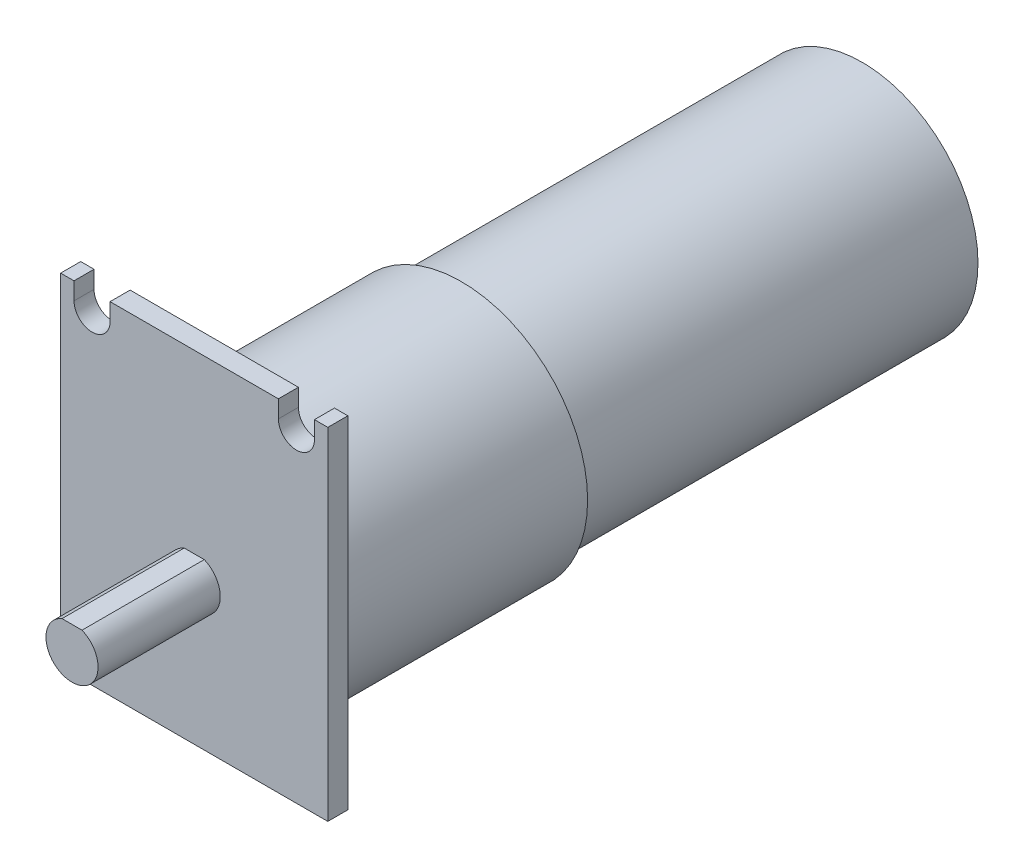
ISO-10303-21;
HEADER;
FILE_DESCRIPTION(('STEP AP214'),'2;1');
FILE_NAME('part.step','',(''),(''),'','','');
FILE_SCHEMA(('AUTOMOTIVE_DESIGN { 1 0 10303 214 1 1 1 1 }'));
ENDSEC;
DATA;
#1=APPLICATION_CONTEXT('core data for automotive mechanical design processes');
#2=APPLICATION_PROTOCOL_DEFINITION('international standard','automotive_design',2000,#1);
#3=PRODUCT_CONTEXT('',#1,'mechanical');
#4=PRODUCT('Part','Part','',(#3));
#5=PRODUCT_RELATED_PRODUCT_CATEGORY('part','',(#4));
#6=PRODUCT_DEFINITION_FORMATION('','',#4);
#7=PRODUCT_DEFINITION_CONTEXT('part definition',#1,'design');
#8=PRODUCT_DEFINITION('design','',#6,#7);
#9=PRODUCT_DEFINITION_SHAPE('','',#8);
#10=(LENGTH_UNIT() NAMED_UNIT(*) SI_UNIT(.MILLI.,.METRE.));
#11=(NAMED_UNIT(*) PLANE_ANGLE_UNIT() SI_UNIT($,.RADIAN.));
#12=(NAMED_UNIT(*) SI_UNIT($,.STERADIAN.) SOLID_ANGLE_UNIT());
#13=UNCERTAINTY_MEASURE_WITH_UNIT(LENGTH_MEASURE(1.E-05),#10,'distance_accuracy_value','');
#14=(GEOMETRIC_REPRESENTATION_CONTEXT(3) GLOBAL_UNCERTAINTY_ASSIGNED_CONTEXT((#13)) GLOBAL_UNIT_ASSIGNED_CONTEXT((#10,
#11,#12)) REPRESENTATION_CONTEXT('',''));
#15=CARTESIAN_POINT('',(0.,0.,0.));
#16=DIRECTION('',(0.,0.,1.));
#17=DIRECTION('',(1.,0.,0.));
#18=AXIS2_PLACEMENT_3D('',#15,#16,#17);
#19=CARTESIAN_POINT('',(0.,0.,60.));
#20=DIRECTION('',(0.,0.,-1.));
#21=DIRECTION('',(-1.,0.,0.));
#22=AXIS2_PLACEMENT_3D('',#19,#20,#21);
#23=CYLINDRICAL_SURFACE('',#22,17.35);
#24=CARTESIAN_POINT('',(0.,0.,60.));
#25=DIRECTION('',(0.,0.,1.));
#26=DIRECTION('',(1.,0.,0.));
#27=AXIS2_PLACEMENT_3D('',#24,#25,#26);
#28=CIRCLE('',#27,17.35);
#29=CARTESIAN_POINT('',(17.35,0.,60.));
#30=VERTEX_POINT('',#29);
#31=EDGE_CURVE('E240',#30,#30,#28,.T.);
#32=ORIENTED_EDGE('',*,*,#31,.F.);
#33=EDGE_LOOP('',(#32));
#34=FACE_BOUND('',#33,.T.);
#35=CARTESIAN_POINT('',(0.,0.,0.));
#36=DIRECTION('',(0.,0.,1.));
#37=DIRECTION('',(1.,0.,0.));
#38=AXIS2_PLACEMENT_3D('',#35,#36,#37);
#39=CIRCLE('',#38,17.35);
#40=CARTESIAN_POINT('',(17.35,0.,0.));
#41=VERTEX_POINT('',#40);
#42=EDGE_CURVE('E237',#41,#41,#39,.T.);
#43=ORIENTED_EDGE('',*,*,#42,.T.);
#44=EDGE_LOOP('',(#43));
#45=FACE_BOUND('',#44,.T.);
#46=ADVANCED_FACE('F52',(#34,#45),#23,.T.);
#47=CARTESIAN_POINT('',(0.,0.,0.));
#48=DIRECTION('',(0.,0.,1.));
#49=DIRECTION('',(1.,0.,0.));
#50=AXIS2_PLACEMENT_3D('',#47,#48,#49);
#51=PLANE('',#50);
#52=ORIENTED_EDGE('',*,*,#42,.F.);
#53=EDGE_LOOP('',(#52));
#54=FACE_BOUND('',#53,.T.);
#55=ADVANCED_FACE('F329',(#54),#51,.F.);
#56=CARTESIAN_POINT('',(0.,0.,97.));
#57=DIRECTION('',(0.,0.,-1.));
#58=DIRECTION('',(-1.,0.,0.));
#59=AXIS2_PLACEMENT_3D('',#56,#57,#58);
#60=CYLINDRICAL_SURFACE('',#59,18.9);
#61=CARTESIAN_POINT('',(0.,0.,97.));
#62=DIRECTION('',(0.,0.,1.));
#63=DIRECTION('',(1.,0.,0.));
#64=AXIS2_PLACEMENT_3D('',#61,#62,#63);
#65=CIRCLE('',#64,18.9);
#66=CARTESIAN_POINT('',(18.9,0.,97.));
#67=VERTEX_POINT('',#66);
#68=EDGE_CURVE('E234',#67,#67,#65,.T.);
#69=ORIENTED_EDGE('',*,*,#68,.F.);
#70=EDGE_LOOP('',(#69));
#71=FACE_BOUND('',#70,.T.);
#72=CARTESIAN_POINT('',(0.,0.,60.));
#73=DIRECTION('',(0.,0.,1.));
#74=DIRECTION('',(1.,0.,0.));
#75=AXIS2_PLACEMENT_3D('',#72,#73,#74);
#76=CIRCLE('',#75,18.9);
#77=CARTESIAN_POINT('',(18.9,0.,60.));
#78=VERTEX_POINT('',#77);
#79=EDGE_CURVE('E215',#78,#78,#76,.T.);
#80=ORIENTED_EDGE('',*,*,#79,.T.);
#81=EDGE_LOOP('',(#80));
#82=FACE_BOUND('',#81,.T.);
#83=ADVANCED_FACE('F334',(#71,#82),#60,.T.);
#84=CARTESIAN_POINT('',(0.,0.,60.));
#85=DIRECTION('',(0.,0.,1.));
#86=DIRECTION('',(1.,0.,0.));
#87=AXIS2_PLACEMENT_3D('',#84,#85,#86);
#88=PLANE('',#87);
#89=ORIENTED_EDGE('',*,*,#31,.T.);
#90=EDGE_LOOP('',(#89));
#91=FACE_BOUND('',#90,.T.);
#92=ORIENTED_EDGE('',*,*,#79,.F.);
#93=EDGE_LOOP('',(#92));
#94=FACE_BOUND('',#93,.T.);
#95=ADVANCED_FACE('F326',(#91,#94),#88,.F.);
#96=CARTESIAN_POINT('',(-20.,21.1,100.));
#97=DIRECTION('',(1.,0.,0.));
#98=DIRECTION('',(0.,1.,0.));
#99=AXIS2_PLACEMENT_3D('',#96,#97,#98);
#100=PLANE('',#99);
#101=DIRECTION('',(0.,-1.,0.));
#102=VECTOR('',#101,1.);
#103=CARTESIAN_POINT('',(-20.,21.1,97.));
#104=LINE('',#103,#102);
#105=CARTESIAN_POINT('',(-20.,30.,97.));
#106=VERTEX_POINT('',#105);
#107=CARTESIAN_POINT('',(-20.,-21.1,97.));
#108=VERTEX_POINT('',#107);
#109=EDGE_CURVE('E212',#106,#108,#104,.T.);
#110=ORIENTED_EDGE('',*,*,#109,.T.);
#111=DIRECTION('',(0.,0.,-1.));
#112=VECTOR('',#111,1.);
#113=CARTESIAN_POINT('',(-20.,-21.1,100.));
#114=LINE('',#113,#112);
#115=CARTESIAN_POINT('',(-20.,-21.1,100.));
#116=VERTEX_POINT('',#115);
#117=EDGE_CURVE('E118',#116,#108,#114,.T.);
#118=ORIENTED_EDGE('',*,*,#117,.F.);
#119=DIRECTION('',(0.,1.,0.));
#120=VECTOR('',#119,1.);
#121=CARTESIAN_POINT('',(-20.,21.1,100.));
#122=LINE('',#121,#120);
#123=CARTESIAN_POINT('',(-20.,30.,100.));
#124=VERTEX_POINT('',#123);
#125=EDGE_CURVE('E72',#116,#124,#122,.T.);
#126=ORIENTED_EDGE('',*,*,#125,.T.);
#127=DIRECTION('',(0.,0.,-1.));
#128=VECTOR('',#127,1.);
#129=CARTESIAN_POINT('',(-20.,30.,100.));
#130=LINE('',#129,#128);
#131=EDGE_CURVE('E127',#124,#106,#130,.T.);
#132=ORIENTED_EDGE('',*,*,#131,.T.);
#133=EDGE_LOOP('',(#110,#118,#126,#132));
#134=FACE_BOUND('',#133,.T.);
#135=ADVANCED_FACE('F317',(#134),#100,.F.);
#136=CARTESIAN_POINT('',(20.,-21.1,100.));
#137=DIRECTION('',(0.,-1.,0.));
#138=DIRECTION('',(1.,0.,0.));
#139=AXIS2_PLACEMENT_3D('',#136,#137,#138);
#140=PLANE('',#139);
#141=DIRECTION('',(-1.,0.,0.));
#142=VECTOR('',#141,1.);
#143=CARTESIAN_POINT('',(20.,-21.1,97.));
#144=LINE('',#143,#142);
#145=CARTESIAN_POINT('',(20.,-21.1,97.));
#146=VERTEX_POINT('',#145);
#147=EDGE_CURVE('E209',#146,#108,#144,.T.);
#148=ORIENTED_EDGE('',*,*,#147,.F.);
#149=DIRECTION('',(0.,0.,-1.));
#150=VECTOR('',#149,1.);
#151=CARTESIAN_POINT('',(20.,-21.1,100.));
#152=LINE('',#151,#150);
#153=CARTESIAN_POINT('',(20.,-21.1,100.));
#154=VERTEX_POINT('',#153);
#155=EDGE_CURVE('E166',#154,#146,#152,.T.);
#156=ORIENTED_EDGE('',*,*,#155,.F.);
#157=DIRECTION('',(-1.,0.,0.));
#158=VECTOR('',#157,1.);
#159=CARTESIAN_POINT('',(20.,-21.1,100.));
#160=LINE('',#159,#158);
#161=EDGE_CURVE('E177',#154,#116,#160,.T.);
#162=ORIENTED_EDGE('',*,*,#161,.T.);
#163=ORIENTED_EDGE('',*,*,#117,.T.);
#164=EDGE_LOOP('',(#148,#156,#162,#163));
#165=FACE_BOUND('',#164,.T.);
#166=ADVANCED_FACE('F318',(#165),#140,.T.);
#167=CARTESIAN_POINT('',(20.,21.1,100.));
#168=DIRECTION('',(1.,0.,0.));
#169=DIRECTION('',(0.,0.,-1.));
#170=AXIS2_PLACEMENT_3D('',#167,#168,#169);
#171=PLANE('',#170);
#172=DIRECTION('',(0.,-1.,0.));
#173=VECTOR('',#172,1.);
#174=CARTESIAN_POINT('',(20.,21.1,97.));
#175=LINE('',#174,#173);
#176=CARTESIAN_POINT('',(20.,30.,97.));
#177=VERTEX_POINT('',#176);
#178=EDGE_CURVE('E163',#177,#146,#175,.T.);
#179=ORIENTED_EDGE('',*,*,#178,.F.);
#180=DIRECTION('',(0.,0.,-1.));
#181=VECTOR('',#180,1.);
#182=CARTESIAN_POINT('',(20.,30.,100.));
#183=LINE('',#182,#181);
#184=CARTESIAN_POINT('',(20.,30.,100.));
#185=VERTEX_POINT('',#184);
#186=EDGE_CURVE('E156',#185,#177,#183,.T.);
#187=ORIENTED_EDGE('',*,*,#186,.F.);
#188=DIRECTION('',(0.,-1.,0.));
#189=VECTOR('',#188,1.);
#190=CARTESIAN_POINT('',(20.,30.,100.));
#191=LINE('',#190,#189);
#192=EDGE_CURVE('E160',#185,#154,#191,.T.);
#193=ORIENTED_EDGE('',*,*,#192,.T.);
#194=ORIENTED_EDGE('',*,*,#155,.T.);
#195=EDGE_LOOP('',(#179,#187,#193,#194));
#196=FACE_BOUND('',#195,.T.);
#197=ADVANCED_FACE('F158',(#196),#171,.T.);
#198=CARTESIAN_POINT('',(20.,30.,100.));
#199=DIRECTION('',(0.,-1.,0.));
#200=DIRECTION('',(0.,0.,-1.));
#201=AXIS2_PLACEMENT_3D('',#198,#199,#200);
#202=PLANE('',#201);
#203=DIRECTION('',(-1.,0.,0.));
#204=VECTOR('',#203,1.);
#205=CARTESIAN_POINT('',(20.,30.,97.));
#206=LINE('',#205,#204);
#207=CARTESIAN_POINT('',(18.,30.,97.));
#208=VERTEX_POINT('',#207);
#209=EDGE_CURVE('E206',#177,#208,#206,.T.);
#210=ORIENTED_EDGE('',*,*,#209,.T.);
#211=DIRECTION('',(0.,0.,-1.));
#212=VECTOR('',#211,1.);
#213=CARTESIAN_POINT('',(18.,30.,100.));
#214=LINE('',#213,#212);
#215=CARTESIAN_POINT('',(18.,30.,100.));
#216=VERTEX_POINT('',#215);
#217=EDGE_CURVE('E167',#216,#208,#214,.T.);
#218=ORIENTED_EDGE('',*,*,#217,.F.);
#219=DIRECTION('',(-1.,0.,0.));
#220=VECTOR('',#219,1.);
#221=CARTESIAN_POINT('',(20.,30.,100.));
#222=LINE('',#221,#220);
#223=EDGE_CURVE('E170',#185,#216,#222,.T.);
#224=ORIENTED_EDGE('',*,*,#223,.F.);
#225=ORIENTED_EDGE('',*,*,#186,.T.);
#226=EDGE_LOOP('',(#210,#218,#224,#225));
#227=FACE_BOUND('',#226,.T.);
#228=ADVANCED_FACE('F171',(#227),#202,.F.);
#229=CARTESIAN_POINT('',(18.,30.,100.));
#230=DIRECTION('',(1.,0.,0.));
#231=DIRECTION('',(0.,0.,-1.));
#232=AXIS2_PLACEMENT_3D('',#229,#230,#231);
#233=PLANE('',#232);
#234=DIRECTION('',(0.,-1.,0.));
#235=VECTOR('',#234,1.);
#236=CARTESIAN_POINT('',(18.,30.,97.));
#237=LINE('',#236,#235);
#238=CARTESIAN_POINT('',(18.,27.4,97.));
#239=VERTEX_POINT('',#238);
#240=EDGE_CURVE('E203',#208,#239,#237,.T.);
#241=ORIENTED_EDGE('',*,*,#240,.T.);
#242=DIRECTION('',(0.,0.,-1.));
#243=VECTOR('',#242,1.);
#244=CARTESIAN_POINT('',(18.,27.4,100.));
#245=LINE('',#244,#243);
#246=CARTESIAN_POINT('',(18.,27.4,100.));
#247=VERTEX_POINT('',#246);
#248=EDGE_CURVE('E218',#247,#239,#245,.T.);
#249=ORIENTED_EDGE('',*,*,#248,.F.);
#250=DIRECTION('',(0.,-1.,0.));
#251=VECTOR('',#250,1.);
#252=CARTESIAN_POINT('',(18.,30.,100.));
#253=LINE('',#252,#251);
#254=EDGE_CURVE('E174',#216,#247,#253,.T.);
#255=ORIENTED_EDGE('',*,*,#254,.F.);
#256=ORIENTED_EDGE('',*,*,#217,.T.);
#257=EDGE_LOOP('',(#241,#249,#255,#256));
#258=FACE_BOUND('',#257,.T.);
#259=ADVANCED_FACE('F285',(#258),#233,.F.);
#260=CARTESIAN_POINT('',(15.3,27.4,100.));
#261=DIRECTION('',(0.,0.,-1.));
#262=DIRECTION('',(-1.,0.,0.));
#263=AXIS2_PLACEMENT_3D('',#260,#261,#262);
#264=CYLINDRICAL_SURFACE('',#263,2.7);
#265=CARTESIAN_POINT('',(15.3,27.4,97.));
#266=DIRECTION('',(0.,0.,1.));
#267=DIRECTION('',(1.,0.,0.));
#268=AXIS2_PLACEMENT_3D('',#265,#266,#267);
#269=CIRCLE('',#268,2.7);
#270=CARTESIAN_POINT('',(12.6,27.4,97.));
#271=VERTEX_POINT('',#270);
#272=EDGE_CURVE('E200',#271,#239,#269,.T.);
#273=ORIENTED_EDGE('',*,*,#272,.F.);
#274=DIRECTION('',(0.,0.,-1.));
#275=VECTOR('',#274,1.);
#276=CARTESIAN_POINT('',(12.6,27.4,100.));
#277=LINE('',#276,#275);
#278=CARTESIAN_POINT('',(12.6,27.4,100.));
#279=VERTEX_POINT('',#278);
#280=EDGE_CURVE('E220',#279,#271,#277,.T.);
#281=ORIENTED_EDGE('',*,*,#280,.F.);
#282=CARTESIAN_POINT('',(15.3,27.4,100.));
#283=DIRECTION('',(0.,0.,1.));
#284=DIRECTION('',(1.,0.,0.));
#285=AXIS2_PLACEMENT_3D('',#282,#283,#284);
#286=CIRCLE('',#285,2.7);
#287=EDGE_CURVE('E280',#279,#247,#286,.T.);
#288=ORIENTED_EDGE('',*,*,#287,.T.);
#289=ORIENTED_EDGE('',*,*,#248,.T.);
#290=EDGE_LOOP('',(#273,#281,#288,#289));
#291=FACE_BOUND('',#290,.T.);
#292=ADVANCED_FACE('F289',(#291),#264,.F.);
#293=CARTESIAN_POINT('',(12.6,27.4,100.));
#294=DIRECTION('',(-1.,0.,0.));
#295=DIRECTION('',(0.,0.,1.));
#296=AXIS2_PLACEMENT_3D('',#293,#294,#295);
#297=PLANE('',#296);
#298=DIRECTION('',(0.,1.,0.));
#299=VECTOR('',#298,1.);
#300=CARTESIAN_POINT('',(12.6,27.4,97.));
#301=LINE('',#300,#299);
#302=CARTESIAN_POINT('',(12.6,30.,97.));
#303=VERTEX_POINT('',#302);
#304=EDGE_CURVE('E198',#271,#303,#301,.T.);
#305=ORIENTED_EDGE('',*,*,#304,.T.);
#306=DIRECTION('',(0.,0.,-1.));
#307=VECTOR('',#306,1.);
#308=CARTESIAN_POINT('',(12.6,30.,100.));
#309=LINE('',#308,#307);
#310=CARTESIAN_POINT('',(12.6,30.,100.));
#311=VERTEX_POINT('',#310);
#312=EDGE_CURVE('E222',#311,#303,#309,.T.);
#313=ORIENTED_EDGE('',*,*,#312,.F.);
#314=DIRECTION('',(0.,1.,0.));
#315=VECTOR('',#314,1.);
#316=CARTESIAN_POINT('',(12.6,27.4,100.));
#317=LINE('',#316,#315);
#318=EDGE_CURVE('E278',#279,#311,#317,.T.);
#319=ORIENTED_EDGE('',*,*,#318,.F.);
#320=ORIENTED_EDGE('',*,*,#280,.T.);
#321=EDGE_LOOP('',(#305,#313,#319,#320));
#322=FACE_BOUND('',#321,.T.);
#323=ADVANCED_FACE('F294',(#322),#297,.F.);
#324=CARTESIAN_POINT('',(12.6,30.,100.));
#325=DIRECTION('',(0.,-1.,0.));
#326=DIRECTION('',(1.,0.,0.));
#327=AXIS2_PLACEMENT_3D('',#324,#325,#326);
#328=PLANE('',#327);
#329=DIRECTION('',(-1.,0.,0.));
#330=VECTOR('',#329,1.);
#331=CARTESIAN_POINT('',(12.6,30.,97.));
#332=LINE('',#331,#330);
#333=CARTESIAN_POINT('',(-12.6,30.,97.));
#334=VERTEX_POINT('',#333);
#335=EDGE_CURVE('E195',#303,#334,#332,.T.);
#336=ORIENTED_EDGE('',*,*,#335,.T.);
#337=DIRECTION('',(0.,0.,-1.));
#338=VECTOR('',#337,1.);
#339=CARTESIAN_POINT('',(-12.6,30.,100.));
#340=LINE('',#339,#338);
#341=CARTESIAN_POINT('',(-12.6,30.,100.));
#342=VERTEX_POINT('',#341);
#343=EDGE_CURVE('E225',#342,#334,#340,.T.);
#344=ORIENTED_EDGE('',*,*,#343,.F.);
#345=DIRECTION('',(-1.,0.,0.));
#346=VECTOR('',#345,1.);
#347=CARTESIAN_POINT('',(12.6,30.,100.));
#348=LINE('',#347,#346);
#349=EDGE_CURVE('E276',#311,#342,#348,.T.);
#350=ORIENTED_EDGE('',*,*,#349,.F.);
#351=ORIENTED_EDGE('',*,*,#312,.T.);
#352=EDGE_LOOP('',(#336,#344,#350,#351));
#353=FACE_BOUND('',#352,.T.);
#354=ADVANCED_FACE('F299',(#353),#328,.F.);
#355=CARTESIAN_POINT('',(-12.6,27.4,100.));
#356=DIRECTION('',(-1.,0.,0.));
#357=DIRECTION('',(0.,0.,1.));
#358=AXIS2_PLACEMENT_3D('',#355,#356,#357);
#359=PLANE('',#358);
#360=DIRECTION('',(0.,1.,0.));
#361=VECTOR('',#360,1.);
#362=CARTESIAN_POINT('',(-12.6,27.4,97.));
#363=LINE('',#362,#361);
#364=CARTESIAN_POINT('',(-12.6,27.4,97.));
#365=VERTEX_POINT('',#364);
#366=EDGE_CURVE('E192',#365,#334,#363,.T.);
#367=ORIENTED_EDGE('',*,*,#366,.F.);
#368=DIRECTION('',(0.,0.,-1.));
#369=VECTOR('',#368,1.);
#370=CARTESIAN_POINT('',(-12.6,27.4,100.));
#371=LINE('',#370,#369);
#372=CARTESIAN_POINT('',(-12.6,27.4,100.));
#373=VERTEX_POINT('',#372);
#374=EDGE_CURVE('E227',#373,#365,#371,.T.);
#375=ORIENTED_EDGE('',*,*,#374,.F.);
#376=DIRECTION('',(0.,1.,0.));
#377=VECTOR('',#376,1.);
#378=CARTESIAN_POINT('',(-12.6,27.4,100.));
#379=LINE('',#378,#377);
#380=EDGE_CURVE('E273',#373,#342,#379,.T.);
#381=ORIENTED_EDGE('',*,*,#380,.T.);
#382=ORIENTED_EDGE('',*,*,#343,.T.);
#383=EDGE_LOOP('',(#367,#375,#381,#382));
#384=FACE_BOUND('',#383,.T.);
#385=ADVANCED_FACE('F303',(#384),#359,.T.);
#386=CARTESIAN_POINT('',(-15.3,27.4,100.));
#387=DIRECTION('',(0.,0.,-1.));
#388=DIRECTION('',(-1.,0.,0.));
#389=AXIS2_PLACEMENT_3D('',#386,#387,#388);
#390=CYLINDRICAL_SURFACE('',#389,2.7);
#391=CARTESIAN_POINT('',(-15.3,27.4,97.));
#392=DIRECTION('',(0.,0.,-1.));
#393=DIRECTION('',(-1.,0.,0.));
#394=AXIS2_PLACEMENT_3D('',#391,#392,#393);
#395=CIRCLE('',#394,2.7);
#396=CARTESIAN_POINT('',(-18.,27.4,97.));
#397=VERTEX_POINT('',#396);
#398=EDGE_CURVE('E189',#365,#397,#395,.T.);
#399=ORIENTED_EDGE('',*,*,#398,.T.);
#400=DIRECTION('',(0.,0.,-1.));
#401=VECTOR('',#400,1.);
#402=CARTESIAN_POINT('',(-18.,27.4,100.));
#403=LINE('',#402,#401);
#404=CARTESIAN_POINT('',(-18.,27.4,100.));
#405=VERTEX_POINT('',#404);
#406=EDGE_CURVE('E229',#405,#397,#403,.T.);
#407=ORIENTED_EDGE('',*,*,#406,.F.);
#408=CARTESIAN_POINT('',(-15.3,27.4,100.));
#409=DIRECTION('',(0.,0.,-1.));
#410=DIRECTION('',(-1.,0.,0.));
#411=AXIS2_PLACEMENT_3D('',#408,#409,#410);
#412=CIRCLE('',#411,2.7);
#413=EDGE_CURVE('E271',#373,#405,#412,.T.);
#414=ORIENTED_EDGE('',*,*,#413,.F.);
#415=ORIENTED_EDGE('',*,*,#374,.T.);
#416=EDGE_LOOP('',(#399,#407,#414,#415));
#417=FACE_BOUND('',#416,.T.);
#418=ADVANCED_FACE('F308',(#417),#390,.F.);
#419=CARTESIAN_POINT('',(-18.,30.,100.));
#420=DIRECTION('',(1.,0.,0.));
#421=DIRECTION('',(0.,0.,-1.));
#422=AXIS2_PLACEMENT_3D('',#419,#420,#421);
#423=PLANE('',#422);
#424=DIRECTION('',(0.,-1.,0.));
#425=VECTOR('',#424,1.);
#426=CARTESIAN_POINT('',(-18.,30.,97.));
#427=LINE('',#426,#425);
#428=CARTESIAN_POINT('',(-18.,30.,97.));
#429=VERTEX_POINT('',#428);
#430=EDGE_CURVE('E185',#429,#397,#427,.T.);
#431=ORIENTED_EDGE('',*,*,#430,.F.);
#432=DIRECTION('',(0.,0.,-1.));
#433=VECTOR('',#432,1.);
#434=CARTESIAN_POINT('',(-18.,30.,100.));
#435=LINE('',#434,#433);
#436=CARTESIAN_POINT('',(-18.,30.,100.));
#437=VERTEX_POINT('',#436);
#438=EDGE_CURVE('E231',#437,#429,#435,.T.);
#439=ORIENTED_EDGE('',*,*,#438,.F.);
#440=DIRECTION('',(0.,-1.,0.));
#441=VECTOR('',#440,1.);
#442=CARTESIAN_POINT('',(-18.,30.,100.));
#443=LINE('',#442,#441);
#444=EDGE_CURVE('E268',#437,#405,#443,.T.);
#445=ORIENTED_EDGE('',*,*,#444,.T.);
#446=ORIENTED_EDGE('',*,*,#406,.T.);
#447=EDGE_LOOP('',(#431,#439,#445,#446));
#448=FACE_BOUND('',#447,.T.);
#449=ADVANCED_FACE('F313',(#448),#423,.T.);
#450=CARTESIAN_POINT('',(-20.,30.,100.));
#451=DIRECTION('',(0.,1.,0.));
#452=DIRECTION('',(-1.,0.,0.));
#453=AXIS2_PLACEMENT_3D('',#450,#451,#452);
#454=PLANE('',#453);
#455=DIRECTION('',(1.,0.,0.));
#456=VECTOR('',#455,1.);
#457=CARTESIAN_POINT('',(-20.,30.,97.));
#458=LINE('',#457,#456);
#459=EDGE_CURVE('E182',#106,#429,#458,.T.);
#460=ORIENTED_EDGE('',*,*,#459,.F.);
#461=ORIENTED_EDGE('',*,*,#131,.F.);
#462=DIRECTION('',(1.,0.,0.));
#463=VECTOR('',#462,1.);
#464=CARTESIAN_POINT('',(-20.,30.,100.));
#465=LINE('',#464,#463);
#466=EDGE_CURVE('E266',#124,#437,#465,.T.);
#467=ORIENTED_EDGE('',*,*,#466,.T.);
#468=ORIENTED_EDGE('',*,*,#438,.T.);
#469=EDGE_LOOP('',(#460,#461,#467,#468));
#470=FACE_BOUND('',#469,.T.);
#471=ADVANCED_FACE('F311',(#470),#454,.T.);
#472=CARTESIAN_POINT('',(-15.3,27.4,100.));
#473=DIRECTION('',(0.,0.,-1.));
#474=DIRECTION('',(-1.,0.,0.));
#475=AXIS2_PLACEMENT_3D('',#472,#473,#474);
#476=PLANE('',#475);
#477=DIRECTION('',(-1.,0.,0.));
#478=VECTOR('',#477,1.);
#479=CARTESIAN_POINT('',(-15.3,3.6,100.));
#480=LINE('',#479,#478);
#481=CARTESIAN_POINT('',(1.5,3.6,100.));
#482=VERTEX_POINT('',#481);
#483=CARTESIAN_POINT('',(-1.5,3.6,100.));
#484=VERTEX_POINT('',#483);
#485=EDGE_CURVE('E12',#482,#484,#480,.T.);
#486=ORIENTED_EDGE('',*,*,#485,.F.);
#487=CARTESIAN_POINT('',(0.,0.,100.));
#488=DIRECTION('',(0.,0.,-1.));
#489=DIRECTION('',(-1.,0.,0.));
#490=AXIS2_PLACEMENT_3D('',#487,#488,#489);
#491=CIRCLE('',#490,3.9);
#492=EDGE_CURVE('E59',#484,#482,#491,.F.);
#493=ORIENTED_EDGE('',*,*,#492,.F.);
#494=EDGE_LOOP('',(#486,#493));
#495=FACE_BOUND('',#494,.T.);
#496=ORIENTED_EDGE('',*,*,#125,.F.);
#497=ORIENTED_EDGE('',*,*,#161,.F.);
#498=ORIENTED_EDGE('',*,*,#192,.F.);
#499=ORIENTED_EDGE('',*,*,#223,.T.);
#500=ORIENTED_EDGE('',*,*,#254,.T.);
#501=ORIENTED_EDGE('',*,*,#287,.F.);
#502=ORIENTED_EDGE('',*,*,#318,.T.);
#503=ORIENTED_EDGE('',*,*,#349,.T.);
#504=ORIENTED_EDGE('',*,*,#380,.F.);
#505=ORIENTED_EDGE('',*,*,#413,.T.);
#506=ORIENTED_EDGE('',*,*,#444,.F.);
#507=ORIENTED_EDGE('',*,*,#466,.F.);
#508=EDGE_LOOP('',(#496,#497,#498,#499,#500,#501,#502,#503,#504,#505,#506,#507));
#509=FACE_BOUND('',#508,.T.);
#510=ADVANCED_FACE('F176',(#495,#509),#476,.F.);
#511=CARTESIAN_POINT('',(-15.3,27.4,97.));
#512=DIRECTION('',(0.,0.,-1.));
#513=DIRECTION('',(-1.,0.,0.));
#514=AXIS2_PLACEMENT_3D('',#511,#512,#513);
#515=PLANE('',#514);
#516=ORIENTED_EDGE('',*,*,#68,.T.);
#517=EDGE_LOOP('',(#516));
#518=FACE_BOUND('',#517,.T.);
#519=ORIENTED_EDGE('',*,*,#109,.F.);
#520=ORIENTED_EDGE('',*,*,#459,.T.);
#521=ORIENTED_EDGE('',*,*,#430,.T.);
#522=ORIENTED_EDGE('',*,*,#398,.F.);
#523=ORIENTED_EDGE('',*,*,#366,.T.);
#524=ORIENTED_EDGE('',*,*,#335,.F.);
#525=ORIENTED_EDGE('',*,*,#304,.F.);
#526=ORIENTED_EDGE('',*,*,#272,.T.);
#527=ORIENTED_EDGE('',*,*,#240,.F.);
#528=ORIENTED_EDGE('',*,*,#209,.F.);
#529=ORIENTED_EDGE('',*,*,#178,.T.);
#530=ORIENTED_EDGE('',*,*,#147,.T.);
#531=EDGE_LOOP('',(#519,#520,#521,#522,#523,#524,#525,#526,#527,#528,#529,#530));
#532=FACE_BOUND('',#531,.T.);
#533=ADVANCED_FACE('F315',(#518,#532),#515,.T.);
#534=CARTESIAN_POINT('',(0.,3.6,118.3));
#535=DIRECTION('',(0.,-1.,0.));
#536=DIRECTION('',(1.,0.,0.));
#537=AXIS2_PLACEMENT_3D('',#534,#535,#536);
#538=PLANE('',#537);
#539=DIRECTION('',(0.,0.,-1.));
#540=VECTOR('',#539,1.);
#541=CARTESIAN_POINT('',(1.5,3.6,118.3));
#542=LINE('',#541,#540);
#543=CARTESIAN_POINT('',(1.5,3.6,118.3));
#544=VERTEX_POINT('',#543);
#545=EDGE_CURVE('E251',#544,#482,#542,.T.);
#546=ORIENTED_EDGE('',*,*,#545,.T.);
#547=ORIENTED_EDGE('',*,*,#485,.T.);
#548=DIRECTION('',(0.,0.,-1.));
#549=VECTOR('',#548,1.);
#550=CARTESIAN_POINT('',(-1.5,3.6,118.3));
#551=LINE('',#550,#549);
#552=CARTESIAN_POINT('',(-1.5,3.6,118.3));
#553=VERTEX_POINT('',#552);
#554=EDGE_CURVE('E186',#553,#484,#551,.T.);
#555=ORIENTED_EDGE('',*,*,#554,.F.);
#556=DIRECTION('',(-1.,0.,0.));
#557=VECTOR('',#556,1.);
#558=CARTESIAN_POINT('',(0.,3.6,118.3));
#559=LINE('',#558,#557);
#560=EDGE_CURVE('E257',#544,#553,#559,.T.);
#561=ORIENTED_EDGE('',*,*,#560,.F.);
#562=EDGE_LOOP('',(#546,#547,#555,#561));
#563=FACE_BOUND('',#562,.T.);
#564=ADVANCED_FACE('F255',(#563),#538,.F.);
#565=CARTESIAN_POINT('',(0.,0.,118.3));
#566=DIRECTION('',(0.,0.,-1.));
#567=DIRECTION('',(-1.,0.,0.));
#568=AXIS2_PLACEMENT_3D('',#565,#566,#567);
#569=CYLINDRICAL_SURFACE('',#568,3.9);
#570=ORIENTED_EDGE('',*,*,#554,.T.);
#571=ORIENTED_EDGE('',*,*,#492,.T.);
#572=ORIENTED_EDGE('',*,*,#545,.F.);
#573=CARTESIAN_POINT('',(0.,0.,118.3));
#574=DIRECTION('',(0.,0.,1.));
#575=DIRECTION('',(1.,0.,0.));
#576=AXIS2_PLACEMENT_3D('',#573,#574,#575);
#577=CIRCLE('',#576,3.9);
#578=EDGE_CURVE('E258',#553,#544,#577,.T.);
#579=ORIENTED_EDGE('',*,*,#578,.F.);
#580=EDGE_LOOP('',(#570,#571,#572,#579));
#581=FACE_BOUND('',#580,.T.);
#582=ADVANCED_FACE('F248',(#581),#569,.T.);
#583=CARTESIAN_POINT('',(0.,0.,118.3));
#584=DIRECTION('',(0.,0.,1.));
#585=DIRECTION('',(1.,0.,0.));
#586=AXIS2_PLACEMENT_3D('',#583,#584,#585);
#587=PLANE('',#586);
#588=ORIENTED_EDGE('',*,*,#560,.T.);
#589=ORIENTED_EDGE('',*,*,#578,.T.);
#590=EDGE_LOOP('',(#588,#589));
#591=FACE_BOUND('',#590,.T.);
#592=ADVANCED_FACE('F431',(#591),#587,.T.);
#593=CLOSED_SHELL('',(#46,#55,#83,#95,#135,#166,#197,#228,#259,#292,#323,#354,#385,#418,#449,
#471,#510,#533,#564,#582,#592));
#594=MANIFOLD_SOLID_BREP('B2',#593);
#595=ADVANCED_BREP_SHAPE_REPRESENTATION('',(#18,#594),#14);
#596=SHAPE_DEFINITION_REPRESENTATION(#9,#595);
ENDSEC;
END-ISO-10303-21;
